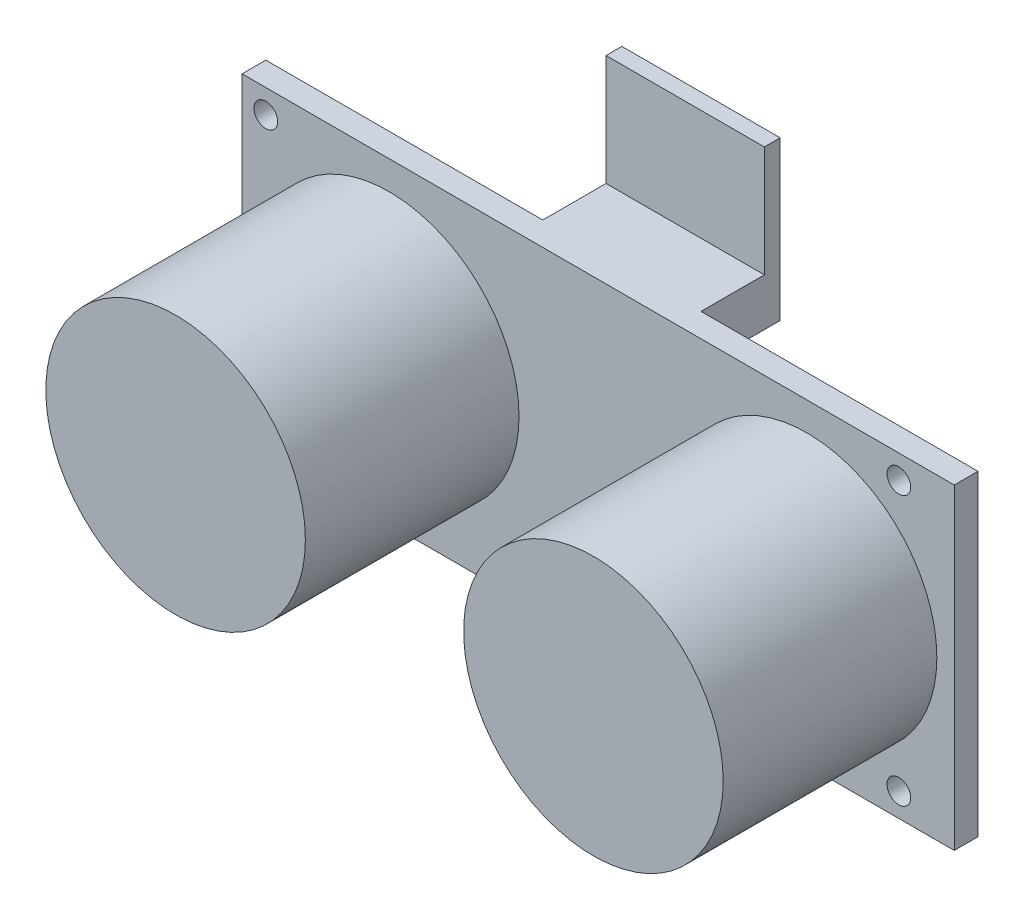
ISO-10303-21;
HEADER;
FILE_DESCRIPTION(('STEP AP214'),'2;1');
FILE_NAME('part.step','',(''),(''),'','','');
FILE_SCHEMA(('AUTOMOTIVE_DESIGN { 1 0 10303 214 1 1 1 1 }'));
ENDSEC;
DATA;
#1=APPLICATION_CONTEXT('core data for automotive mechanical design processes');
#2=APPLICATION_PROTOCOL_DEFINITION('international standard','automotive_design',2000,#1);
#3=PRODUCT_CONTEXT('',#1,'mechanical');
#4=PRODUCT('Part','Part','',(#3));
#5=PRODUCT_RELATED_PRODUCT_CATEGORY('part','',(#4));
#6=PRODUCT_DEFINITION_FORMATION('','',#4);
#7=PRODUCT_DEFINITION_CONTEXT('part definition',#1,'design');
#8=PRODUCT_DEFINITION('design','',#6,#7);
#9=PRODUCT_DEFINITION_SHAPE('','',#8);
#10=(LENGTH_UNIT() NAMED_UNIT(*) SI_UNIT(.MILLI.,.METRE.));
#11=(NAMED_UNIT(*) PLANE_ANGLE_UNIT() SI_UNIT($,.RADIAN.));
#12=(NAMED_UNIT(*) SI_UNIT($,.STERADIAN.) SOLID_ANGLE_UNIT());
#13=UNCERTAINTY_MEASURE_WITH_UNIT(LENGTH_MEASURE(1.E-05),#10,'distance_accuracy_value','');
#14=(GEOMETRIC_REPRESENTATION_CONTEXT(3) GLOBAL_UNCERTAINTY_ASSIGNED_CONTEXT((#13)) GLOBAL_UNIT_ASSIGNED_CONTEXT((#10,
#11,#12)) REPRESENTATION_CONTEXT('',''));
#15=CARTESIAN_POINT('',(0.,0.,0.));
#16=DIRECTION('',(0.,0.,1.));
#17=DIRECTION('',(1.,0.,0.));
#18=AXIS2_PLACEMENT_3D('',#15,#16,#17);
#19=CARTESIAN_POINT('',(0.,20.,-1.5));
#20=DIRECTION('',(0.,-1.,0.));
#21=DIRECTION('',(0.,0.,-1.));
#22=AXIS2_PLACEMENT_3D('',#19,#20,#21);
#23=PLANE('',#22);
#24=DIRECTION('',(1.,0.,0.));
#25=VECTOR('',#24,1.);
#26=CARTESIAN_POINT('',(0.,20.,-5.5));
#27=LINE('',#26,#25);
#28=CARTESIAN_POINT('',(17.5,20.,-5.5));
#29=VERTEX_POINT('',#28);
#30=CARTESIAN_POINT('',(27.5,20.,-5.5));
#31=VERTEX_POINT('',#30);
#32=EDGE_CURVE('E60',#29,#31,#27,.T.);
#33=ORIENTED_EDGE('',*,*,#32,.F.);
#34=DIRECTION('',(0.,0.,1.));
#35=VECTOR('',#34,1.);
#36=CARTESIAN_POINT('',(17.5,20.,0.));
#37=LINE('',#36,#35);
#38=CARTESIAN_POINT('',(17.5,20.,-1.5));
#39=VERTEX_POINT('',#38);
#40=EDGE_CURVE('E157',#29,#39,#37,.T.);
#41=ORIENTED_EDGE('',*,*,#40,.T.);
#42=DIRECTION('',(1.,0.,0.));
#43=VECTOR('',#42,1.);
#44=CARTESIAN_POINT('',(0.,20.,-1.5));
#45=LINE('',#44,#43);
#46=CARTESIAN_POINT('',(0.,20.,-1.5));
#47=VERTEX_POINT('',#46);
#48=EDGE_CURVE('E205',#47,#39,#45,.T.);
#49=ORIENTED_EDGE('',*,*,#48,.F.);
#50=DIRECTION('',(0.,0.,1.));
#51=VECTOR('',#50,1.);
#52=CARTESIAN_POINT('',(0.,20.,-1.5));
#53=LINE('',#52,#51);
#54=CARTESIAN_POINT('',(0.,20.,0.));
#55=VERTEX_POINT('',#54);
#56=EDGE_CURVE('E52',#47,#55,#53,.T.);
#57=ORIENTED_EDGE('',*,*,#56,.T.);
#58=DIRECTION('',(1.,0.,0.));
#59=VECTOR('',#58,1.);
#60=CARTESIAN_POINT('',(0.,20.,0.));
#61=LINE('',#60,#59);
#62=CARTESIAN_POINT('',(45.,20.,0.));
#63=VERTEX_POINT('',#62);
#64=EDGE_CURVE('E228',#55,#63,#61,.T.);
#65=ORIENTED_EDGE('',*,*,#64,.T.);
#66=DIRECTION('',(0.,0.,1.));
#67=VECTOR('',#66,1.);
#68=CARTESIAN_POINT('',(45.,20.,-1.5));
#69=LINE('',#68,#67);
#70=CARTESIAN_POINT('',(45.,20.,-1.5));
#71=VERTEX_POINT('',#70);
#72=EDGE_CURVE('E234',#71,#63,#69,.T.);
#73=ORIENTED_EDGE('',*,*,#72,.F.);
#74=CARTESIAN_POINT('',(27.5,20.,-1.5));
#75=VERTEX_POINT('',#74);
#76=EDGE_CURVE('E204',#75,#71,#45,.T.);
#77=ORIENTED_EDGE('',*,*,#76,.F.);
#78=DIRECTION('',(0.,0.,1.));
#79=VECTOR('',#78,1.);
#80=CARTESIAN_POINT('',(27.5,20.,0.));
#81=LINE('',#80,#79);
#82=EDGE_CURVE('E67',#31,#75,#81,.T.);
#83=ORIENTED_EDGE('',*,*,#82,.F.);
#84=EDGE_LOOP('',(#33,#41,#49,#57,#65,#73,#77,#83));
#85=FACE_BOUND('',#84,.T.);
#86=ADVANCED_FACE('F43',(#85),#23,.F.);
#87=CARTESIAN_POINT('',(0.,0.,-1.5));
#88=DIRECTION('',(0.,0.,1.));
#89=DIRECTION('',(1.,0.,0.));
#90=AXIS2_PLACEMENT_3D('',#87,#88,#89);
#91=PLANE('',#90);
#92=CARTESIAN_POINT('',(1.5,1.5,-1.5));
#93=DIRECTION('',(0.,0.,1.));
#94=DIRECTION('',(1.,0.,0.));
#95=AXIS2_PLACEMENT_3D('',#92,#93,#94);
#96=CIRCLE('',#95,0.75);
#97=CARTESIAN_POINT('',(2.25,1.5,-1.5));
#98=VERTEX_POINT('',#97);
#99=EDGE_CURVE('E195',#98,#98,#96,.T.);
#100=ORIENTED_EDGE('',*,*,#99,.T.);
#101=EDGE_LOOP('',(#100));
#102=FACE_BOUND('',#101,.T.);
#103=CARTESIAN_POINT('',(1.5,18.5,-1.5));
#104=DIRECTION('',(0.,0.,1.));
#105=DIRECTION('',(1.,0.,0.));
#106=AXIS2_PLACEMENT_3D('',#103,#104,#105);
#107=CIRCLE('',#106,0.75);
#108=CARTESIAN_POINT('',(2.25,18.5,-1.5));
#109=VERTEX_POINT('',#108);
#110=EDGE_CURVE('E192',#109,#109,#107,.T.);
#111=ORIENTED_EDGE('',*,*,#110,.T.);
#112=EDGE_LOOP('',(#111));
#113=FACE_BOUND('',#112,.T.);
#114=CARTESIAN_POINT('',(41.5,18.5,-1.5));
#115=DIRECTION('',(0.,0.,1.));
#116=DIRECTION('',(1.,0.,0.));
#117=AXIS2_PLACEMENT_3D('',#114,#115,#116);
#118=CIRCLE('',#117,0.749999999999999);
#119=CARTESIAN_POINT('',(42.25,18.5,-1.5));
#120=VERTEX_POINT('',#119);
#121=EDGE_CURVE('E188',#120,#120,#118,.T.);
#122=ORIENTED_EDGE('',*,*,#121,.T.);
#123=EDGE_LOOP('',(#122));
#124=FACE_BOUND('',#123,.T.);
#125=CARTESIAN_POINT('',(41.5,1.5,-1.5));
#126=DIRECTION('',(0.,0.,1.));
#127=DIRECTION('',(1.,0.,0.));
#128=AXIS2_PLACEMENT_3D('',#125,#126,#127);
#129=CIRCLE('',#128,0.749999999999999);
#130=CARTESIAN_POINT('',(42.25,1.5,-1.5));
#131=VERTEX_POINT('',#130);
#132=EDGE_CURVE('E185',#131,#131,#129,.T.);
#133=ORIENTED_EDGE('',*,*,#132,.T.);
#134=EDGE_LOOP('',(#133));
#135=FACE_BOUND('',#134,.T.);
#136=DIRECTION('',(0.,1.,0.));
#137=VECTOR('',#136,1.);
#138=CARTESIAN_POINT('',(17.5,17.,-1.5));
#139=LINE('',#138,#137);
#140=CARTESIAN_POINT('',(17.5,17.,-1.5));
#141=VERTEX_POINT('',#140);
#142=EDGE_CURVE('E134',#141,#39,#139,.T.);
#143=ORIENTED_EDGE('',*,*,#142,.F.);
#144=DIRECTION('',(-1.,0.,0.));
#145=VECTOR('',#144,1.);
#146=CARTESIAN_POINT('',(0.,17.,-1.5));
#147=LINE('',#146,#145);
#148=CARTESIAN_POINT('',(27.5,17.,-1.5));
#149=VERTEX_POINT('',#148);
#150=EDGE_CURVE('E161',#149,#141,#147,.T.);
#151=ORIENTED_EDGE('',*,*,#150,.F.);
#152=DIRECTION('',(0.,1.,0.));
#153=VECTOR('',#152,1.);
#154=CARTESIAN_POINT('',(27.5,17.,-1.5));
#155=LINE('',#154,#153);
#156=EDGE_CURVE('E169',#149,#75,#155,.T.);
#157=ORIENTED_EDGE('',*,*,#156,.T.);
#158=ORIENTED_EDGE('',*,*,#76,.T.);
#159=DIRECTION('',(0.,1.,0.));
#160=VECTOR('',#159,1.);
#161=CARTESIAN_POINT('',(45.,0.,-1.5));
#162=LINE('',#161,#160);
#163=CARTESIAN_POINT('',(45.,0.,-1.5));
#164=VERTEX_POINT('',#163);
#165=EDGE_CURVE('E201',#164,#71,#162,.T.);
#166=ORIENTED_EDGE('',*,*,#165,.F.);
#167=DIRECTION('',(1.,0.,0.));
#168=VECTOR('',#167,1.);
#169=CARTESIAN_POINT('',(0.,0.,-1.5));
#170=LINE('',#169,#168);
#171=CARTESIAN_POINT('',(0.,0.,-1.5));
#172=VERTEX_POINT('',#171);
#173=EDGE_CURVE('E198',#172,#164,#170,.T.);
#174=ORIENTED_EDGE('',*,*,#173,.F.);
#175=DIRECTION('',(0.,1.,0.));
#176=VECTOR('',#175,1.);
#177=CARTESIAN_POINT('',(0.,0.,-1.5));
#178=LINE('',#177,#176);
#179=EDGE_CURVE('E208',#172,#47,#178,.T.);
#180=ORIENTED_EDGE('',*,*,#179,.T.);
#181=ORIENTED_EDGE('',*,*,#48,.T.);
#182=EDGE_LOOP('',(#143,#151,#157,#158,#166,#174,#180,#181));
#183=FACE_BOUND('',#182,.T.);
#184=ADVANCED_FACE('F253',(#102,#113,#124,#135,#183),#91,.F.);
#185=CARTESIAN_POINT('',(0.,0.,-1.5));
#186=DIRECTION('',(0.,-1.,0.));
#187=DIRECTION('',(0.,0.,-1.));
#188=AXIS2_PLACEMENT_3D('',#185,#186,#187);
#189=PLANE('',#188);
#190=DIRECTION('',(1.,0.,0.));
#191=VECTOR('',#190,1.);
#192=CARTESIAN_POINT('',(0.,0.,0.));
#193=LINE('',#192,#191);
#194=CARTESIAN_POINT('',(0.,0.,0.));
#195=VERTEX_POINT('',#194);
#196=CARTESIAN_POINT('',(45.,0.,0.));
#197=VERTEX_POINT('',#196);
#198=EDGE_CURVE('E222',#195,#197,#193,.T.);
#199=ORIENTED_EDGE('',*,*,#198,.F.);
#200=DIRECTION('',(0.,0.,1.));
#201=VECTOR('',#200,1.);
#202=CARTESIAN_POINT('',(0.,0.,-1.5));
#203=LINE('',#202,#201);
#204=EDGE_CURVE('E11',#172,#195,#203,.T.);
#205=ORIENTED_EDGE('',*,*,#204,.F.);
#206=ORIENTED_EDGE('',*,*,#173,.T.);
#207=DIRECTION('',(0.,0.,1.));
#208=VECTOR('',#207,1.);
#209=CARTESIAN_POINT('',(45.,0.,-1.5));
#210=LINE('',#209,#208);
#211=EDGE_CURVE('E47',#164,#197,#210,.T.);
#212=ORIENTED_EDGE('',*,*,#211,.T.);
#213=EDGE_LOOP('',(#199,#205,#206,#212));
#214=FACE_BOUND('',#213,.T.);
#215=ADVANCED_FACE('F240',(#214),#189,.T.);
#216=CARTESIAN_POINT('',(0.,0.,-1.5));
#217=DIRECTION('',(1.,0.,0.));
#218=DIRECTION('',(0.,0.,-1.));
#219=AXIS2_PLACEMENT_3D('',#216,#217,#218);
#220=PLANE('',#219);
#221=DIRECTION('',(0.,1.,0.));
#222=VECTOR('',#221,1.);
#223=CARTESIAN_POINT('',(0.,0.,0.));
#224=LINE('',#223,#222);
#225=EDGE_CURVE('E189',#195,#55,#224,.T.);
#226=ORIENTED_EDGE('',*,*,#225,.T.);
#227=ORIENTED_EDGE('',*,*,#56,.F.);
#228=ORIENTED_EDGE('',*,*,#179,.F.);
#229=ORIENTED_EDGE('',*,*,#204,.T.);
#230=EDGE_LOOP('',(#226,#227,#228,#229));
#231=FACE_BOUND('',#230,.T.);
#232=ADVANCED_FACE('F249',(#231),#220,.F.);
#233=CARTESIAN_POINT('',(1.5,1.5,-1.5));
#234=DIRECTION('',(0.,0.,1.));
#235=DIRECTION('',(1.,0.,0.));
#236=AXIS2_PLACEMENT_3D('',#233,#234,#235);
#237=CYLINDRICAL_SURFACE('',#236,0.75);
#238=ORIENTED_EDGE('',*,*,#99,.F.);
#239=EDGE_LOOP('',(#238));
#240=FACE_BOUND('',#239,.T.);
#241=CARTESIAN_POINT('',(1.5,1.5,0.));
#242=DIRECTION('',(0.,0.,1.));
#243=DIRECTION('',(1.,0.,0.));
#244=AXIS2_PLACEMENT_3D('',#241,#242,#243);
#245=CIRCLE('',#244,0.75);
#246=CARTESIAN_POINT('',(2.25,1.5,0.));
#247=VERTEX_POINT('',#246);
#248=EDGE_CURVE('E219',#247,#247,#245,.T.);
#249=ORIENTED_EDGE('',*,*,#248,.T.);
#250=EDGE_LOOP('',(#249));
#251=FACE_BOUND('',#250,.T.);
#252=ADVANCED_FACE('F286',(#240,#251),#237,.F.);
#253=CARTESIAN_POINT('',(1.5,18.5,-1.5));
#254=DIRECTION('',(0.,0.,1.));
#255=DIRECTION('',(1.,0.,0.));
#256=AXIS2_PLACEMENT_3D('',#253,#254,#255);
#257=CYLINDRICAL_SURFACE('',#256,0.75);
#258=ORIENTED_EDGE('',*,*,#110,.F.);
#259=EDGE_LOOP('',(#258));
#260=FACE_BOUND('',#259,.T.);
#261=CARTESIAN_POINT('',(1.5,18.5,0.));
#262=DIRECTION('',(0.,0.,1.));
#263=DIRECTION('',(1.,0.,0.));
#264=AXIS2_PLACEMENT_3D('',#261,#262,#263);
#265=CIRCLE('',#264,0.75);
#266=CARTESIAN_POINT('',(2.25,18.5,0.));
#267=VERTEX_POINT('',#266);
#268=EDGE_CURVE('E216',#267,#267,#265,.T.);
#269=ORIENTED_EDGE('',*,*,#268,.T.);
#270=EDGE_LOOP('',(#269));
#271=FACE_BOUND('',#270,.T.);
#272=ADVANCED_FACE('F289',(#260,#271),#257,.F.);
#273=CARTESIAN_POINT('',(41.5,18.5,-1.5));
#274=DIRECTION('',(0.,0.,1.));
#275=DIRECTION('',(1.,0.,0.));
#276=AXIS2_PLACEMENT_3D('',#273,#274,#275);
#277=CYLINDRICAL_SURFACE('',#276,0.749999999999999);
#278=ORIENTED_EDGE('',*,*,#121,.F.);
#279=EDGE_LOOP('',(#278));
#280=FACE_BOUND('',#279,.T.);
#281=CARTESIAN_POINT('',(41.5,18.5,0.));
#282=DIRECTION('',(0.,0.,1.));
#283=DIRECTION('',(1.,0.,0.));
#284=AXIS2_PLACEMENT_3D('',#281,#282,#283);
#285=CIRCLE('',#284,0.749999999999999);
#286=CARTESIAN_POINT('',(42.25,18.5,0.));
#287=VERTEX_POINT('',#286);
#288=EDGE_CURVE('E213',#287,#287,#285,.T.);
#289=ORIENTED_EDGE('',*,*,#288,.T.);
#290=EDGE_LOOP('',(#289));
#291=FACE_BOUND('',#290,.T.);
#292=ADVANCED_FACE('F292',(#280,#291),#277,.F.);
#293=CARTESIAN_POINT('',(41.5,1.5,-1.5));
#294=DIRECTION('',(0.,0.,1.));
#295=DIRECTION('',(1.,0.,0.));
#296=AXIS2_PLACEMENT_3D('',#293,#294,#295);
#297=CYLINDRICAL_SURFACE('',#296,0.749999999999999);
#298=ORIENTED_EDGE('',*,*,#132,.F.);
#299=EDGE_LOOP('',(#298));
#300=FACE_BOUND('',#299,.T.);
#301=CARTESIAN_POINT('',(41.5,1.5,0.));
#302=DIRECTION('',(0.,0.,1.));
#303=DIRECTION('',(1.,0.,0.));
#304=AXIS2_PLACEMENT_3D('',#301,#302,#303);
#305=CIRCLE('',#304,0.749999999999999);
#306=CARTESIAN_POINT('',(42.25,1.5,0.));
#307=VERTEX_POINT('',#306);
#308=EDGE_CURVE('E182',#307,#307,#305,.T.);
#309=ORIENTED_EDGE('',*,*,#308,.T.);
#310=EDGE_LOOP('',(#309));
#311=FACE_BOUND('',#310,.T.);
#312=ADVANCED_FACE('F45',(#300,#311),#297,.F.);
#313=CARTESIAN_POINT('',(45.,0.,-1.5));
#314=DIRECTION('',(1.,0.,0.));
#315=DIRECTION('',(0.,0.,-1.));
#316=AXIS2_PLACEMENT_3D('',#313,#314,#315);
#317=PLANE('',#316);
#318=DIRECTION('',(0.,1.,0.));
#319=VECTOR('',#318,1.);
#320=CARTESIAN_POINT('',(45.,0.,0.));
#321=LINE('',#320,#319);
#322=EDGE_CURVE('E225',#197,#63,#321,.T.);
#323=ORIENTED_EDGE('',*,*,#322,.F.);
#324=ORIENTED_EDGE('',*,*,#211,.F.);
#325=ORIENTED_EDGE('',*,*,#165,.T.);
#326=ORIENTED_EDGE('',*,*,#72,.T.);
#327=EDGE_LOOP('',(#323,#324,#325,#326));
#328=FACE_BOUND('',#327,.T.);
#329=ADVANCED_FACE('F243',(#328),#317,.T.);
#330=CARTESIAN_POINT('',(0.,0.,0.));
#331=DIRECTION('',(0.,0.,1.));
#332=DIRECTION('',(1.,0.,0.));
#333=AXIS2_PLACEMENT_3D('',#330,#331,#332);
#334=PLANE('',#333);
#335=CARTESIAN_POINT('',(35.7,10.,0.));
#336=DIRECTION('',(0.,0.,1.));
#337=DIRECTION('',(1.,0.,0.));
#338=AXIS2_PLACEMENT_3D('',#335,#336,#337);
#339=CIRCLE('',#338,8.2);
#340=CARTESIAN_POINT('',(43.9,10.,0.));
#341=VERTEX_POINT('',#340);
#342=EDGE_CURVE('E168',#341,#341,#339,.T.);
#343=ORIENTED_EDGE('',*,*,#342,.F.);
#344=EDGE_LOOP('',(#343));
#345=FACE_BOUND('',#344,.T.);
#346=CARTESIAN_POINT('',(9.3,10.,0.));
#347=DIRECTION('',(0.,0.,1.));
#348=DIRECTION('',(1.,0.,0.));
#349=AXIS2_PLACEMENT_3D('',#346,#347,#348);
#350=CIRCLE('',#349,8.2);
#351=CARTESIAN_POINT('',(17.5,10.,0.));
#352=VERTEX_POINT('',#351);
#353=EDGE_CURVE('E176',#352,#352,#350,.T.);
#354=ORIENTED_EDGE('',*,*,#353,.F.);
#355=EDGE_LOOP('',(#354));
#356=FACE_BOUND('',#355,.T.);
#357=ORIENTED_EDGE('',*,*,#308,.F.);
#358=EDGE_LOOP('',(#357));
#359=FACE_BOUND('',#358,.T.);
#360=ORIENTED_EDGE('',*,*,#288,.F.);
#361=EDGE_LOOP('',(#360));
#362=FACE_BOUND('',#361,.T.);
#363=ORIENTED_EDGE('',*,*,#268,.F.);
#364=EDGE_LOOP('',(#363));
#365=FACE_BOUND('',#364,.T.);
#366=ORIENTED_EDGE('',*,*,#248,.F.);
#367=EDGE_LOOP('',(#366));
#368=FACE_BOUND('',#367,.T.);
#369=ORIENTED_EDGE('',*,*,#198,.T.);
#370=ORIENTED_EDGE('',*,*,#322,.T.);
#371=ORIENTED_EDGE('',*,*,#64,.F.);
#372=ORIENTED_EDGE('',*,*,#225,.F.);
#373=EDGE_LOOP('',(#369,#370,#371,#372));
#374=FACE_BOUND('',#373,.T.);
#375=ADVANCED_FACE('F246',(#345,#356,#359,#362,#365,#368,#374),#334,.T.);
#376=CARTESIAN_POINT('',(9.3,10.,13.5));
#377=DIRECTION('',(0.,0.,-1.));
#378=DIRECTION('',(-1.,0.,0.));
#379=AXIS2_PLACEMENT_3D('',#376,#377,#378);
#380=CYLINDRICAL_SURFACE('',#379,8.2);
#381=CARTESIAN_POINT('',(9.3,10.,13.5));
#382=DIRECTION('',(0.,0.,1.));
#383=DIRECTION('',(1.,0.,0.));
#384=AXIS2_PLACEMENT_3D('',#381,#382,#383);
#385=CIRCLE('',#384,8.2);
#386=CARTESIAN_POINT('',(17.5,10.,13.5));
#387=VERTEX_POINT('',#386);
#388=EDGE_CURVE('E179',#387,#387,#385,.T.);
#389=ORIENTED_EDGE('',*,*,#388,.F.);
#390=EDGE_LOOP('',(#389));
#391=FACE_BOUND('',#390,.T.);
#392=ORIENTED_EDGE('',*,*,#353,.T.);
#393=EDGE_LOOP('',(#392));
#394=FACE_BOUND('',#393,.T.);
#395=ADVANCED_FACE('F307',(#391,#394),#380,.T.);
#396=CARTESIAN_POINT('',(0.,0.,13.5));
#397=DIRECTION('',(0.,0.,1.));
#398=DIRECTION('',(1.,0.,0.));
#399=AXIS2_PLACEMENT_3D('',#396,#397,#398);
#400=PLANE('',#399);
#401=ORIENTED_EDGE('',*,*,#388,.T.);
#402=EDGE_LOOP('',(#401));
#403=FACE_BOUND('',#402,.T.);
#404=ADVANCED_FACE('F318',(#403),#400,.T.);
#405=CARTESIAN_POINT('',(35.7,10.,13.5));
#406=DIRECTION('',(0.,0.,-1.));
#407=DIRECTION('',(-1.,0.,0.));
#408=AXIS2_PLACEMENT_3D('',#405,#406,#407);
#409=CYLINDRICAL_SURFACE('',#408,8.2);
#410=CARTESIAN_POINT('',(35.7,10.,13.5));
#411=DIRECTION('',(0.,0.,1.));
#412=DIRECTION('',(1.,0.,0.));
#413=AXIS2_PLACEMENT_3D('',#410,#411,#412);
#414=CIRCLE('',#413,8.2);
#415=CARTESIAN_POINT('',(43.9,10.,13.5));
#416=VERTEX_POINT('',#415);
#417=EDGE_CURVE('E173',#416,#416,#414,.T.);
#418=ORIENTED_EDGE('',*,*,#417,.F.);
#419=EDGE_LOOP('',(#418));
#420=FACE_BOUND('',#419,.T.);
#421=ORIENTED_EDGE('',*,*,#342,.T.);
#422=EDGE_LOOP('',(#421));
#423=FACE_BOUND('',#422,.T.);
#424=ADVANCED_FACE('F326',(#420,#423),#409,.T.);
#425=CARTESIAN_POINT('',(0.,0.,13.5));
#426=DIRECTION('',(0.,0.,1.));
#427=DIRECTION('',(1.,0.,0.));
#428=AXIS2_PLACEMENT_3D('',#425,#426,#427);
#429=PLANE('',#428);
#430=ORIENTED_EDGE('',*,*,#417,.T.);
#431=EDGE_LOOP('',(#430));
#432=FACE_BOUND('',#431,.T.);
#433=ADVANCED_FACE('F268',(#432),#429,.T.);
#434=CARTESIAN_POINT('',(0.,17.,-6.5));
#435=DIRECTION('',(0.,0.,1.));
#436=DIRECTION('',(1.,0.,0.));
#437=AXIS2_PLACEMENT_3D('',#434,#435,#436);
#438=PLANE('',#437);
#439=DIRECTION('',(0.,1.,0.));
#440=VECTOR('',#439,1.);
#441=CARTESIAN_POINT('',(17.5,17.,-6.5));
#442=LINE('',#441,#440);
#443=CARTESIAN_POINT('',(17.5,17.,-6.5));
#444=VERTEX_POINT('',#443);
#445=CARTESIAN_POINT('',(17.5,27.,-6.5));
#446=VERTEX_POINT('',#445);
#447=EDGE_CURVE('E122',#444,#446,#442,.T.);
#448=ORIENTED_EDGE('',*,*,#447,.T.);
#449=DIRECTION('',(1.,0.,0.));
#450=VECTOR('',#449,1.);
#451=CARTESIAN_POINT('',(0.,27.,-6.5));
#452=LINE('',#451,#450);
#453=CARTESIAN_POINT('',(27.5,27.,-6.5));
#454=VERTEX_POINT('',#453);
#455=EDGE_CURVE('E127',#446,#454,#452,.T.);
#456=ORIENTED_EDGE('',*,*,#455,.T.);
#457=DIRECTION('',(0.,1.,0.));
#458=VECTOR('',#457,1.);
#459=CARTESIAN_POINT('',(27.5,17.,-6.5));
#460=LINE('',#459,#458);
#461=CARTESIAN_POINT('',(27.5,17.,-6.5));
#462=VERTEX_POINT('',#461);
#463=EDGE_CURVE('E166',#462,#454,#460,.T.);
#464=ORIENTED_EDGE('',*,*,#463,.F.);
#465=DIRECTION('',(1.,0.,0.));
#466=VECTOR('',#465,1.);
#467=CARTESIAN_POINT('',(0.,17.,-6.5));
#468=LINE('',#467,#466);
#469=EDGE_CURVE('E130',#444,#462,#468,.T.);
#470=ORIENTED_EDGE('',*,*,#469,.F.);
#471=EDGE_LOOP('',(#448,#456,#464,#470));
#472=FACE_BOUND('',#471,.T.);
#473=ADVANCED_FACE('F124',(#472),#438,.F.);
#474=CARTESIAN_POINT('',(27.5,17.,0.));
#475=DIRECTION('',(-1.,0.,0.));
#476=DIRECTION('',(0.,0.,1.));
#477=AXIS2_PLACEMENT_3D('',#474,#475,#476);
#478=PLANE('',#477);
#479=ORIENTED_EDGE('',*,*,#463,.T.);
#480=DIRECTION('',(0.,0.,1.));
#481=VECTOR('',#480,1.);
#482=CARTESIAN_POINT('',(27.5,27.,0.));
#483=LINE('',#482,#481);
#484=CARTESIAN_POINT('',(27.5,27.,-5.5));
#485=VERTEX_POINT('',#484);
#486=EDGE_CURVE('E148',#454,#485,#483,.T.);
#487=ORIENTED_EDGE('',*,*,#486,.T.);
#488=DIRECTION('',(0.,-1.,0.));
#489=VECTOR('',#488,1.);
#490=CARTESIAN_POINT('',(27.5,27.,-5.5));
#491=LINE('',#490,#489);
#492=EDGE_CURVE('E153',#485,#31,#491,.T.);
#493=ORIENTED_EDGE('',*,*,#492,.T.);
#494=ORIENTED_EDGE('',*,*,#82,.T.);
#495=ORIENTED_EDGE('',*,*,#156,.F.);
#496=DIRECTION('',(0.,0.,1.));
#497=VECTOR('',#496,1.);
#498=CARTESIAN_POINT('',(27.5,17.,0.));
#499=LINE('',#498,#497);
#500=EDGE_CURVE('E135',#462,#149,#499,.T.);
#501=ORIENTED_EDGE('',*,*,#500,.F.);
#502=EDGE_LOOP('',(#479,#487,#493,#494,#495,#501));
#503=FACE_BOUND('',#502,.T.);
#504=ADVANCED_FACE('F258',(#503),#478,.F.);
#505=CARTESIAN_POINT('',(17.5,17.,0.));
#506=DIRECTION('',(-1.,0.,0.));
#507=DIRECTION('',(0.,0.,1.));
#508=AXIS2_PLACEMENT_3D('',#505,#506,#507);
#509=PLANE('',#508);
#510=ORIENTED_EDGE('',*,*,#40,.F.);
#511=DIRECTION('',(0.,-1.,0.));
#512=VECTOR('',#511,1.);
#513=CARTESIAN_POINT('',(17.5,27.,-5.5));
#514=LINE('',#513,#512);
#515=CARTESIAN_POINT('',(17.5,27.,-5.5));
#516=VERTEX_POINT('',#515);
#517=EDGE_CURVE('E141',#516,#29,#514,.T.);
#518=ORIENTED_EDGE('',*,*,#517,.F.);
#519=DIRECTION('',(0.,0.,1.));
#520=VECTOR('',#519,1.);
#521=CARTESIAN_POINT('',(17.5,27.,0.));
#522=LINE('',#521,#520);
#523=EDGE_CURVE('E138',#446,#516,#522,.T.);
#524=ORIENTED_EDGE('',*,*,#523,.F.);
#525=ORIENTED_EDGE('',*,*,#447,.F.);
#526=DIRECTION('',(0.,0.,1.));
#527=VECTOR('',#526,1.);
#528=CARTESIAN_POINT('',(17.5,17.,0.));
#529=LINE('',#528,#527);
#530=EDGE_CURVE('E159',#444,#141,#529,.T.);
#531=ORIENTED_EDGE('',*,*,#530,.T.);
#532=ORIENTED_EDGE('',*,*,#142,.T.);
#533=EDGE_LOOP('',(#510,#518,#524,#525,#531,#532));
#534=FACE_BOUND('',#533,.T.);
#535=ADVANCED_FACE('F139',(#534),#509,.T.);
#536=CARTESIAN_POINT('',(0.,17.,0.));
#537=DIRECTION('',(0.,1.,0.));
#538=DIRECTION('',(0.,0.,1.));
#539=AXIS2_PLACEMENT_3D('',#536,#537,#538);
#540=PLANE('',#539);
#541=ORIENTED_EDGE('',*,*,#469,.T.);
#542=ORIENTED_EDGE('',*,*,#500,.T.);
#543=ORIENTED_EDGE('',*,*,#150,.T.);
#544=ORIENTED_EDGE('',*,*,#530,.F.);
#545=EDGE_LOOP('',(#541,#542,#543,#544));
#546=FACE_BOUND('',#545,.T.);
#547=ADVANCED_FACE('F257',(#546),#540,.F.);
#548=CARTESIAN_POINT('',(0.,27.,-5.5));
#549=DIRECTION('',(0.,0.,-1.));
#550=DIRECTION('',(-1.,0.,0.));
#551=AXIS2_PLACEMENT_3D('',#548,#549,#550);
#552=PLANE('',#551);
#553=ORIENTED_EDGE('',*,*,#32,.T.);
#554=ORIENTED_EDGE('',*,*,#492,.F.);
#555=DIRECTION('',(1.,0.,0.));
#556=VECTOR('',#555,1.);
#557=CARTESIAN_POINT('',(0.,27.,-5.5));
#558=LINE('',#557,#556);
#559=EDGE_CURVE('E144',#516,#485,#558,.T.);
#560=ORIENTED_EDGE('',*,*,#559,.F.);
#561=ORIENTED_EDGE('',*,*,#517,.T.);
#562=EDGE_LOOP('',(#553,#554,#560,#561));
#563=FACE_BOUND('',#562,.T.);
#564=ADVANCED_FACE('F372',(#563),#552,.F.);
#565=CARTESIAN_POINT('',(0.,27.,0.));
#566=DIRECTION('',(0.,1.,0.));
#567=DIRECTION('',(0.,0.,1.));
#568=AXIS2_PLACEMENT_3D('',#565,#566,#567);
#569=PLANE('',#568);
#570=ORIENTED_EDGE('',*,*,#455,.F.);
#571=ORIENTED_EDGE('',*,*,#523,.T.);
#572=ORIENTED_EDGE('',*,*,#559,.T.);
#573=ORIENTED_EDGE('',*,*,#486,.F.);
#574=EDGE_LOOP('',(#570,#571,#572,#573));
#575=FACE_BOUND('',#574,.T.);
#576=ADVANCED_FACE('F146',(#575),#569,.T.);
#577=CLOSED_SHELL('',(#86,#184,#215,#232,#252,#272,#292,#312,#329,#375,#395,#404,#424,#433,#473,
#504,#535,#547,#564,#576));
#578=MANIFOLD_SOLID_BREP('B2',#577);
#579=ADVANCED_BREP_SHAPE_REPRESENTATION('',(#18,#578),#14);
#580=SHAPE_DEFINITION_REPRESENTATION(#9,#579);
ENDSEC;
END-ISO-10303-21;
